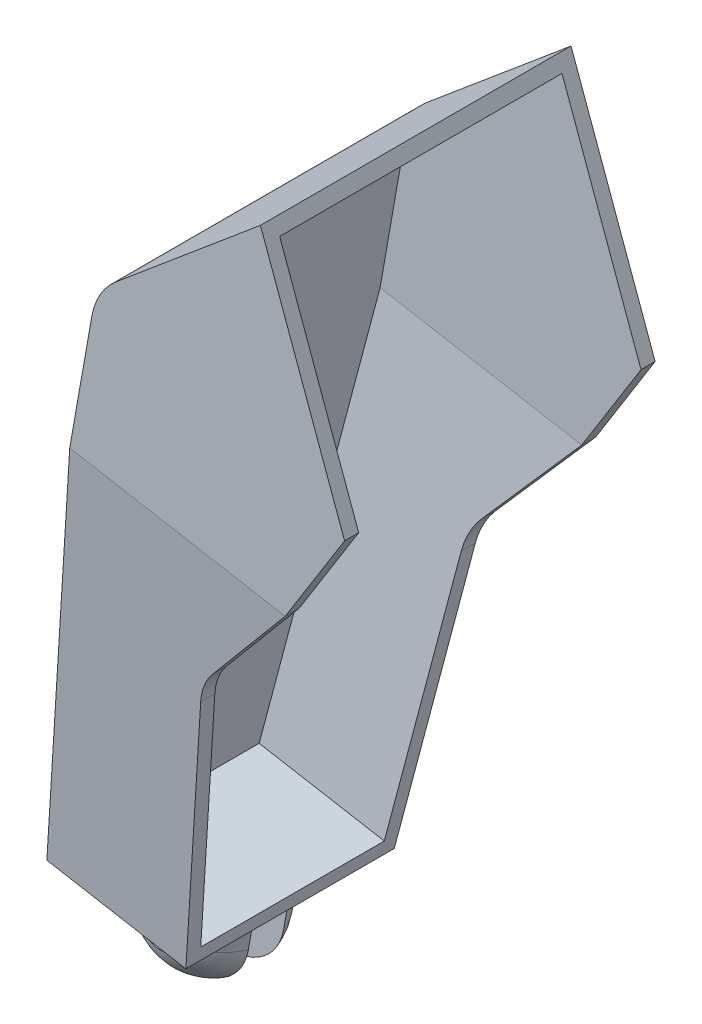
ISO-10303-21;
HEADER;
FILE_DESCRIPTION(('STEP AP214'),'2;1');
FILE_NAME('part.step','',(''),(''),'','','');
FILE_SCHEMA(('AUTOMOTIVE_DESIGN { 1 0 10303 214 1 1 1 1 }'));
ENDSEC;
DATA;
#1=APPLICATION_CONTEXT('core data for automotive mechanical design processes');
#2=APPLICATION_PROTOCOL_DEFINITION('international standard','automotive_design',2000,#1);
#3=PRODUCT_CONTEXT('',#1,'mechanical');
#4=PRODUCT('Part','Part','',(#3));
#5=PRODUCT_RELATED_PRODUCT_CATEGORY('part','',(#4));
#6=PRODUCT_DEFINITION_FORMATION('','',#4);
#7=PRODUCT_DEFINITION_CONTEXT('part definition',#1,'design');
#8=PRODUCT_DEFINITION('design','',#6,#7);
#9=PRODUCT_DEFINITION_SHAPE('','',#8);
#10=(LENGTH_UNIT() NAMED_UNIT(*) SI_UNIT(.MILLI.,.METRE.));
#11=(NAMED_UNIT(*) PLANE_ANGLE_UNIT() SI_UNIT($,.RADIAN.));
#12=(NAMED_UNIT(*) SI_UNIT($,.STERADIAN.) SOLID_ANGLE_UNIT());
#13=UNCERTAINTY_MEASURE_WITH_UNIT(LENGTH_MEASURE(1.E-05),#10,'distance_accuracy_value','');
#14=(GEOMETRIC_REPRESENTATION_CONTEXT(3) GLOBAL_UNCERTAINTY_ASSIGNED_CONTEXT((#13)) GLOBAL_UNIT_ASSIGNED_CONTEXT((#10,
#11,#12)) REPRESENTATION_CONTEXT('',''));
#15=CARTESIAN_POINT('',(0.,0.,0.));
#16=DIRECTION('',(0.,0.,1.));
#17=DIRECTION('',(1.,0.,0.));
#18=AXIS2_PLACEMENT_3D('',#15,#16,#17);
#19=CARTESIAN_POINT('',(-14.4608286388368,-56.6156186188573,0.));
#20=DIRECTION('',(0.173648177666934,0.984807753012207,0.));
#21=DIRECTION('',(-0.984807753012207,0.173648177666935,0.));
#22=AXIS2_PLACEMENT_3D('',#19,#20,#21);
#23=CYLINDRICAL_SURFACE('',#22,8.);
#24=CARTESIAN_POINT('',(-14.4608286388368,-56.6156186188573,0.));
#25=DIRECTION('',(-0.173648177666935,-0.984807753012207,0.));
#26=DIRECTION('',(0.984807753012207,-0.173648177666935,0.));
#27=AXIS2_PLACEMENT_3D('',#24,#25,#26);
#28=CIRCLE('',#27,8.);
#29=CARTESIAN_POINT('',(-11.9988092563063,-57.0497390630246,-7.59934207678533));
#30=VERTEX_POINT('',#29);
#31=CARTESIAN_POINT('',(-6.97693764382676,-57.9352305219587,-2.5));
#32=VERTEX_POINT('',#31);
#33=EDGE_CURVE('E231',#30,#32,#28,.T.);
#34=ORIENTED_EDGE('',*,*,#33,.F.);
#35=CARTESIAN_POINT('',(-11.9988092563063,-57.0497390630246,-7.59934207678533));
#36=CARTESIAN_POINT('',(-11.986911665757,-56.9823146897524,-7.59933203220922));
#37=CARTESIAN_POINT('',(-11.9778018977963,-56.9144045369731,-7.60026710840752));
#38=CARTESIAN_POINT('',(-11.9651804501062,-56.7781308140768,-7.60395280971297));
#39=CARTESIAN_POINT('',(-11.9616674218779,-56.7097673571681,-7.60670299725467));
#40=CARTESIAN_POINT('',(-11.9602580359532,-56.5732555667083,-7.61393458112745));
#41=CARTESIAN_POINT('',(-11.9623466338651,-56.5051071480988,-7.61841131278036));
#42=CARTESIAN_POINT('',(-11.9720563796974,-56.3693459735373,-7.6289504842887));
#43=CARTESIAN_POINT('',(-11.9796776920844,-56.3017332335693,-7.63501297127916));
#44=CARTESIAN_POINT('',(-12.0107279213109,-56.100459949405,-7.65531370854753));
#45=CARTESIAN_POINT('',(-12.0423415697917,-55.9681803915759,-7.67167572075674));
#46=CARTESIAN_POINT('',(-12.1263132939414,-55.7109717660266,-7.70820192005305));
#47=CARTESIAN_POINT('',(-12.1786821543027,-55.586046558549,-7.72836808096862));
#48=CARTESIAN_POINT('',(-12.3046448605937,-55.3427482657027,-7.77100200100207));
#49=CARTESIAN_POINT('',(-12.3788455500893,-55.2246977097717,-7.79352168290434));
#50=CARTESIAN_POINT('',(-12.5458846803246,-55.0024466228951,-7.83788426191899));
#51=CARTESIAN_POINT('',(-12.6387263222109,-54.8982484758914,-7.85972704204464));
#52=CARTESIAN_POINT('',(-12.8431005379144,-54.7042732606988,-7.90087147079049));
#53=CARTESIAN_POINT('',(-12.9550084105571,-54.614875729897,-7.92010445950432));
#54=CARTESIAN_POINT('',(-13.1929881001554,-54.4562165636242,-7.95325160259884));
#55=CARTESIAN_POINT('',(-13.3190560093785,-54.3869493916336,-7.96716721976608));
#56=CARTESIAN_POINT('',(-13.5776350899435,-54.2726872917639,-7.98774341182992));
#57=CARTESIAN_POINT('',(-13.7098273280441,-54.2270092395066,-7.99461464054537));
#58=CARTESIAN_POINT('',(-13.9801340944216,-54.1583095791482,-8.00107192504111));
#59=CARTESIAN_POINT('',(-14.1182473906508,-54.1352832813423,-8.00065948912979));
#60=CARTESIAN_POINT('',(-14.3913407105814,-54.112960728774,-7.99274230032514));
#61=CARTESIAN_POINT('',(-14.5262642522517,-54.1128725353329,-7.98548293529422));
#62=CARTESIAN_POINT('',(-14.7939152414185,-54.1342720022124,-7.96498949974384));
#63=CARTESIAN_POINT('',(-14.9266425704505,-54.1557608225733,-7.95175510801139));
#64=CARTESIAN_POINT('',(-15.1880187980339,-54.2198874665731,-7.9204691112071));
#65=CARTESIAN_POINT('',(-15.3165978158428,-54.2627811480784,-7.90236047967987));
#66=CARTESIAN_POINT('',(-15.5648021209183,-54.3685203602263,-7.8632342385186));
#67=CARTESIAN_POINT('',(-15.6844252286769,-54.4313707281445,-7.8422159243077));
#68=CARTESIAN_POINT('',(-15.9166534247685,-54.5784055906833,-7.79847545376802));
#69=CARTESIAN_POINT('',(-16.0287598091777,-54.6633685712468,-7.77571879037652));
#70=CARTESIAN_POINT('',(-16.2373761622307,-54.8510874963556,-7.73181622612155));
#71=CARTESIAN_POINT('',(-16.3338814283951,-54.953848786395,-7.71067081193134));
#72=CARTESIAN_POINT('',(-16.5095959927525,-55.1758840412729,-7.67220528704821));
#73=CARTESIAN_POINT('',(-16.5885898912219,-55.2953370120725,-7.65493278862475));
#74=CARTESIAN_POINT('',(-16.7251855896486,-55.5464865148217,-7.62673815128782));
#75=CARTESIAN_POINT('',(-16.7828203784918,-55.6781637697896,-7.61580620458632));
#76=CARTESIAN_POINT('',(-16.849080977384,-55.8738082876989,-7.60564225124819));
#77=CARTESIAN_POINT('',(-16.8671107612119,-55.9345703975068,-7.60328541577438));
#78=CARTESIAN_POINT('',(-16.8984930104579,-56.0572385889805,-7.60013482131107));
#79=CARTESIAN_POINT('',(-16.9118520589791,-56.1191429300401,-7.59933885501905));
#80=CARTESIAN_POINT('',(-16.9228480213674,-56.1814981746899,-7.59934207678533));
#81=B_SPLINE_CURVE_WITH_KNOTS('',3,(#35,#36,#37,#38,#39,#40,#41,#42,#43,#44,#45,#46,#47,#48,#49,
#50,#51,#52,#53,#54,#55,#56,#57,#58,#59,#60,#61,#62,#63,#64,#65,#66,#67,#68,#69,#70,#71,#72,#73,
#74,#75,#76,#77,#78,#79,#80),.UNSPECIFIED.,.F.,.F.,(4,2,2,2,2,2,2,2,2,2,2,2,2,2,2,2,2,2,2,2,2,2,
4),(0.,0.205323959879014,0.410598440771326,0.615322164613754,0.820051974362706,1.22896577749256,
1.63809233699274,2.05988351400979,2.48174718582288,2.91315381297358,3.34444167638914,
3.7624189439242,4.18030965733329,4.58377069824372,4.98725343150324,5.39567896994656,
5.8042035818021,6.22971654236829,6.6553575226076,7.0859747210149,7.51592403685478,
7.70602799872317,7.89586293072484),.UNSPECIFIED.);
#82=CARTESIAN_POINT('',(-16.9228480213674,-56.1814981746899,-7.59934207678533));
#83=VERTEX_POINT('',#82);
#84=EDGE_CURVE('E54',#30,#83,#81,.T.);
#85=ORIENTED_EDGE('',*,*,#84,.T.);
#86=CARTESIAN_POINT('',(-21.9447196338469,-55.2960067157558,-2.5));
#87=VERTEX_POINT('',#86);
#88=EDGE_CURVE('E232',#87,#83,#28,.T.);
#89=ORIENTED_EDGE('',*,*,#88,.F.);
#90=DIRECTION('',(0.173648177666934,0.984807753012207,0.));
#91=VECTOR('',#90,1.);
#92=CARTESIAN_POINT('',(-21.9447196338469,-55.2960067157558,-2.5));
#93=LINE('',#92,#91);
#94=CARTESIAN_POINT('',(-20.9028305678453,-49.3871601976826,-2.5));
#95=VERTEX_POINT('',#94);
#96=EDGE_CURVE('E237',#87,#95,#93,.T.);
#97=ORIENTED_EDGE('',*,*,#96,.T.);
#98=CARTESIAN_POINT('',(-13.4189395728352,-50.706772100784,0.));
#99=DIRECTION('',(-0.173648177666935,-0.984807753012207,0.));
#100=DIRECTION('',(0.984807753012207,-0.173648177666935,0.));
#101=AXIS2_PLACEMENT_3D('',#98,#99,#100);
#102=CIRCLE('',#101,8.);
#103=CARTESIAN_POINT('',(-5.93504857782515,-52.0263840038855,-2.5));
#104=VERTEX_POINT('',#103);
#105=EDGE_CURVE('E436',#95,#104,#102,.T.);
#106=ORIENTED_EDGE('',*,*,#105,.T.);
#107=DIRECTION('',(0.173648177666934,0.984807753012207,0.));
#108=VECTOR('',#107,1.);
#109=CARTESIAN_POINT('',(-6.97693764382676,-57.9352305219587,-2.5));
#110=LINE('',#109,#108);
#111=EDGE_CURVE('E694',#104,#32,#110,.F.);
#112=ORIENTED_EDGE('',*,*,#111,.T.);
#113=EDGE_LOOP('',(#34,#85,#89,#97,#106,#112));
#114=FACE_BOUND('',#113,.T.);
#115=ADVANCED_FACE('F39',(#114),#23,.T.);
#116=CARTESIAN_POINT('',(-14.4608286388368,-56.6156186188573,0.));
#117=DIRECTION('',(0.173648177666934,0.984807753012207,0.));
#118=DIRECTION('',(-0.984807753012207,0.173648177666934,0.));
#119=AXIS2_PLACEMENT_3D('',#116,#117,#118);
#120=SPHERICAL_SURFACE('',#119,8.);
#121=ORIENTED_EDGE('',*,*,#88,.T.);
#122=CARTESIAN_POINT('',(-14.4608286388368,-56.6156186188573,-7.59934207678533));
#123=DIRECTION('',(0.,0.,1.));
#124=DIRECTION('',(1.,0.,0.));
#125=AXIS2_PLACEMENT_3D('',#122,#123,#124);
#126=CIRCLE('',#125,2.5);
#127=EDGE_CURVE('E224',#83,#30,#126,.T.);
#128=ORIENTED_EDGE('',*,*,#127,.T.);
#129=ORIENTED_EDGE('',*,*,#33,.T.);
#130=CARTESIAN_POINT('',(-14.4608286388368,-56.6156186188573,-2.5));
#131=DIRECTION('',(0.,0.,-1.));
#132=DIRECTION('',(0.,1.,0.));
#133=AXIS2_PLACEMENT_3D('',#130,#131,#132);
#134=CIRCLE('',#133,7.59934207678533);
#135=EDGE_CURVE('E11',#32,#87,#134,.T.);
#136=ORIENTED_EDGE('',*,*,#135,.T.);
#137=EDGE_LOOP('',(#121,#128,#129,#136));
#138=FACE_BOUND('',#137,.T.);
#139=ADVANCED_FACE('F241',(#138),#120,.T.);
#140=CARTESIAN_POINT('',(-9.659894213322,28.1995383371761,20.));
#141=DIRECTION('',(0.984807753012207,-0.173648177666935,0.));
#142=DIRECTION('',(0.173648177666935,0.984807753012207,0.));
#143=AXIS2_PLACEMENT_3D('',#140,#141,#142);
#144=PLANE('',#143);
#145=DIRECTION('',(0.172412384214125,0.977799220070488,-0.119090952633464));
#146=VECTOR('',#145,1.);
#147=CARTESIAN_POINT('',(-12.7855614113268,10.4729987829563,-22.));
#148=LINE('',#147,#146);
#149=CARTESIAN_POINT('',(-23.2670171029573,-48.9702903241147,-14.7601108876757));
#150=VERTEX_POINT('',#149);
#151=CARTESIAN_POINT('',(-12.7855614113268,10.4729987829563,-22.));
#152=VERTEX_POINT('',#151);
#153=EDGE_CURVE('E481',#150,#152,#148,.T.);
#154=ORIENTED_EDGE('',*,*,#153,.F.);
#155=DIRECTION('',(0.,0.,1.));
#156=VECTOR('',#155,1.);
#157=CARTESIAN_POINT('',(-23.2670171029573,-48.9702903241147,-14.7601108876757));
#158=LINE('',#157,#156);
#159=CARTESIAN_POINT('',(-23.2670171029573,-48.9702903241147,14.7601108876757));
#160=VERTEX_POINT('',#159);
#161=EDGE_CURVE('E229',#150,#160,#158,.T.);
#162=ORIENTED_EDGE('',*,*,#161,.T.);
#163=DIRECTION('',(0.172412384214125,0.977799220070488,0.119090952633464));
#164=VECTOR('',#163,1.);
#165=CARTESIAN_POINT('',(-12.7855614113268,10.4729987829563,22.));
#166=LINE('',#165,#164);
#167=CARTESIAN_POINT('',(-12.7855614113268,10.4729987829563,22.));
#168=VERTEX_POINT('',#167);
#169=EDGE_CURVE('E516',#160,#168,#166,.T.);
#170=ORIENTED_EDGE('',*,*,#169,.T.);
#171=DIRECTION('',(-0.173648177666935,-0.984807753012207,0.));
#172=VECTOR('',#171,1.);
#173=CARTESIAN_POINT('',(-9.659894213322,28.1995383371761,22.));
#174=LINE('',#173,#172);
#175=CARTESIAN_POINT('',(-9.659894213322,28.1995383371761,22.));
#176=VERTEX_POINT('',#175);
#177=EDGE_CURVE('E532',#176,#168,#174,.T.);
#178=ORIENTED_EDGE('',*,*,#177,.F.);
#179=DIRECTION('',(0.,0.,-1.));
#180=VECTOR('',#179,1.);
#181=CARTESIAN_POINT('',(-9.659894213322,28.1995383371761,20.));
#182=LINE('',#181,#180);
#183=CARTESIAN_POINT('',(-9.659894213322,28.1995383371761,-22.));
#184=VERTEX_POINT('',#183);
#185=EDGE_CURVE('E418',#176,#184,#182,.T.);
#186=ORIENTED_EDGE('',*,*,#185,.T.);
#187=DIRECTION('',(-0.173648177666935,-0.984807753012207,0.));
#188=VECTOR('',#187,1.);
#189=CARTESIAN_POINT('',(-9.659894213322,28.1995383371761,-22.));
#190=LINE('',#189,#188);
#191=EDGE_CURVE('E497',#184,#152,#190,.T.);
#192=ORIENTED_EDGE('',*,*,#191,.T.);
#193=EDGE_LOOP('',(#154,#162,#170,#178,#186,#192));
#194=FACE_BOUND('',#193,.T.);
#195=ADVANCED_FACE('F295',(#194),#144,.F.);
#196=CARTESIAN_POINT('',(-7.81668424310827,27.1353605647001,20.));
#197=DIRECTION('',(0.984807753012207,-0.173648177666935,0.));
#198=DIRECTION('',(0.173648177666935,0.984807753012207,0.));
#199=AXIS2_PLACEMENT_3D('',#196,#197,#198);
#200=PLANE('',#199);
#201=DIRECTION('',(0.,0.,-1.));
#202=VECTOR('',#201,1.);
#203=CARTESIAN_POINT('',(-20.950105241599,-47.3479711734241,20.));
#204=LINE('',#203,#202);
#205=CARTESIAN_POINT('',(-20.950105241599,-47.3479711734241,13.));
#206=VERTEX_POINT('',#205);
#207=CARTESIAN_POINT('',(-20.950105241599,-47.3479711734241,-13.));
#208=VERTEX_POINT('',#207);
#209=EDGE_CURVE('E420',#206,#208,#204,.T.);
#210=ORIENTED_EDGE('',*,*,#209,.T.);
#211=DIRECTION('',(-0.172412384214125,-0.977799220070488,0.119090952633464));
#212=VECTOR('',#211,1.);
#213=CARTESIAN_POINT('',(-10.8159459053024,10.1257024276225,-20.));
#214=LINE('',#213,#212);
#215=CARTESIAN_POINT('',(-10.8159459053024,10.1257024276225,-20.));
#216=VERTEX_POINT('',#215);
#217=EDGE_CURVE('E404',#216,#208,#214,.T.);
#218=ORIENTED_EDGE('',*,*,#217,.F.);
#219=DIRECTION('',(-0.173648177666935,-0.984807753012207,0.));
#220=VECTOR('',#219,1.);
#221=CARTESIAN_POINT('',(-7.81668424310827,27.1353605647001,-20.));
#222=LINE('',#221,#220);
#223=CARTESIAN_POINT('',(-7.81668424310827,27.1353605647001,-20.));
#224=VERTEX_POINT('',#223);
#225=EDGE_CURVE('E401',#224,#216,#222,.T.);
#226=ORIENTED_EDGE('',*,*,#225,.F.);
#227=DIRECTION('',(0.,0.,-1.));
#228=VECTOR('',#227,1.);
#229=CARTESIAN_POINT('',(-7.81668424310827,27.1353605647001,20.));
#230=LINE('',#229,#228);
#231=CARTESIAN_POINT('',(-7.81668424310827,27.1353605647001,20.));
#232=VERTEX_POINT('',#231);
#233=EDGE_CURVE('E423',#232,#224,#230,.T.);
#234=ORIENTED_EDGE('',*,*,#233,.F.);
#235=DIRECTION('',(-0.173648177666935,-0.984807753012207,0.));
#236=VECTOR('',#235,1.);
#237=CARTESIAN_POINT('',(-7.81668424310827,27.1353605647001,20.));
#238=LINE('',#237,#236);
#239=CARTESIAN_POINT('',(-10.8159459053024,10.1257024276225,20.));
#240=VERTEX_POINT('',#239);
#241=EDGE_CURVE('E407',#232,#240,#238,.T.);
#242=ORIENTED_EDGE('',*,*,#241,.T.);
#243=DIRECTION('',(-0.172412384214125,-0.977799220070488,-0.119090952633464));
#244=VECTOR('',#243,1.);
#245=CARTESIAN_POINT('',(-10.8159459053024,10.1257024276225,20.));
#246=LINE('',#245,#244);
#247=EDGE_CURVE('E399',#240,#206,#246,.T.);
#248=ORIENTED_EDGE('',*,*,#247,.T.);
#249=EDGE_LOOP('',(#210,#218,#226,#234,#242,#248));
#250=FACE_BOUND('',#249,.T.);
#251=ADVANCED_FACE('F377',(#250),#200,.T.);
#252=CARTESIAN_POINT('',(14.2294707775733,51.2991685834183,20.));
#253=DIRECTION('',(0.939692620785911,0.342020143325662,0.));
#254=DIRECTION('',(-0.342020143325662,0.939692620785911,0.));
#255=AXIS2_PLACEMENT_3D('',#252,#253,#254);
#256=PLANE('',#255);
#257=DIRECTION('',(0.,0.,-1.));
#258=VECTOR('',#257,1.);
#259=CARTESIAN_POINT('',(14.9574112461057,49.2991685834183,20.));
#260=LINE('',#259,#258);
#261=CARTESIAN_POINT('',(14.9574112461057,49.2991685834183,20.));
#262=VERTEX_POINT('',#261);
#263=CARTESIAN_POINT('',(14.9574112461057,49.2991685834183,-20.));
#264=VERTEX_POINT('',#263);
#265=EDGE_CURVE('E394',#262,#264,#260,.T.);
#266=ORIENTED_EDGE('',*,*,#265,.T.);
#267=DIRECTION('',(-0.342020143325662,0.939692620785911,0.));
#268=VECTOR('',#267,1.);
#269=CARTESIAN_POINT('',(14.2294707775733,51.2991685834183,-20.));
#270=LINE('',#269,#268);
#271=CARTESIAN_POINT('',(26.1510654801716,18.544856334139,-20.));
#272=VERTEX_POINT('',#271);
#273=EDGE_CURVE('E486',#272,#264,#270,.T.);
#274=ORIENTED_EDGE('',*,*,#273,.F.);
#275=DIRECTION('',(0.,0.,1.));
#276=VECTOR('',#275,1.);
#277=CARTESIAN_POINT('',(26.1510654801716,18.544856334139,-22.));
#278=LINE('',#277,#276);
#279=CARTESIAN_POINT('',(26.1510654801716,18.544856334139,-22.));
#280=VERTEX_POINT('',#279);
#281=EDGE_CURVE('E514',#280,#272,#278,.T.);
#282=ORIENTED_EDGE('',*,*,#281,.F.);
#283=DIRECTION('',(-0.342020143325662,0.939692620785911,0.));
#284=VECTOR('',#283,1.);
#285=CARTESIAN_POINT('',(14.2294707775733,51.2991685834183,-22.));
#286=LINE('',#285,#284);
#287=CARTESIAN_POINT('',(14.2294707775733,51.2991685834183,-22.));
#288=VERTEX_POINT('',#287);
#289=EDGE_CURVE('E487',#280,#288,#286,.T.);
#290=ORIENTED_EDGE('',*,*,#289,.T.);
#291=DIRECTION('',(0.,0.,-1.));
#292=VECTOR('',#291,1.);
#293=CARTESIAN_POINT('',(14.2294707775733,51.2991685834183,20.));
#294=LINE('',#293,#292);
#295=CARTESIAN_POINT('',(14.2294707775733,51.2991685834183,22.));
#296=VERTEX_POINT('',#295);
#297=EDGE_CURVE('E413',#296,#288,#294,.T.);
#298=ORIENTED_EDGE('',*,*,#297,.F.);
#299=DIRECTION('',(-0.342020143325662,0.939692620785911,0.));
#300=VECTOR('',#299,1.);
#301=CARTESIAN_POINT('',(14.2294707775733,51.2991685834183,22.));
#302=LINE('',#301,#300);
#303=CARTESIAN_POINT('',(26.1510654801716,18.544856334139,22.));
#304=VERTEX_POINT('',#303);
#305=EDGE_CURVE('E522',#304,#296,#302,.T.);
#306=ORIENTED_EDGE('',*,*,#305,.F.);
#307=DIRECTION('',(0.,0.,-1.));
#308=VECTOR('',#307,1.);
#309=CARTESIAN_POINT('',(26.1510654801716,18.544856334139,22.));
#310=LINE('',#309,#308);
#311=CARTESIAN_POINT('',(26.1510654801716,18.544856334139,20.));
#312=VERTEX_POINT('',#311);
#313=EDGE_CURVE('E539',#304,#312,#310,.T.);
#314=ORIENTED_EDGE('',*,*,#313,.T.);
#315=DIRECTION('',(-0.342020143325662,0.939692620785911,0.));
#316=VECTOR('',#315,1.);
#317=CARTESIAN_POINT('',(14.2294707775733,51.2991685834183,20.));
#318=LINE('',#317,#316);
#319=EDGE_CURVE('E521',#312,#262,#318,.T.);
#320=ORIENTED_EDGE('',*,*,#319,.T.);
#321=EDGE_LOOP('',(#266,#274,#282,#290,#298,#306,#314,#320));
#322=FACE_BOUND('',#321,.T.);
#323=ADVANCED_FACE('F41',(#322),#256,.T.);
#324=CARTESIAN_POINT('',(14.2294707775733,51.2991685834183,20.));
#325=DIRECTION('',(0.642787609686535,-0.766044443118982,0.));
#326=DIRECTION('',(0.766044443118982,0.642787609686535,0.));
#327=AXIS2_PLACEMENT_3D('',#324,#325,#326);
#328=PLANE('',#327);
#329=ORIENTED_EDGE('',*,*,#297,.T.);
#330=DIRECTION('',(-0.766044443118982,-0.642787609686535,0.));
#331=VECTOR('',#330,1.);
#332=CARTESIAN_POINT('',(14.2294707775733,51.2991685834183,-22.));
#333=LINE('',#332,#331);
#334=CARTESIAN_POINT('',(-6.23969278006529,34.1235009916965,-22.));
#335=VERTEX_POINT('',#334);
#336=EDGE_CURVE('E503',#288,#335,#333,.T.);
#337=ORIENTED_EDGE('',*,*,#336,.T.);
#338=DIRECTION('',(0.,0.,-1.));
#339=VECTOR('',#338,1.);
#340=CARTESIAN_POINT('',(-6.23969278006528,34.1235009916965,20.));
#341=LINE('',#340,#339);
#342=CARTESIAN_POINT('',(-6.23969278006529,34.1235009916965,22.));
#343=VERTEX_POINT('',#342);
#344=EDGE_CURVE('E416',#343,#335,#341,.T.);
#345=ORIENTED_EDGE('',*,*,#344,.F.);
#346=DIRECTION('',(-0.766044443118982,-0.642787609686535,0.));
#347=VECTOR('',#346,1.);
#348=CARTESIAN_POINT('',(14.2294707775733,51.2991685834183,22.));
#349=LINE('',#348,#347);
#350=EDGE_CURVE('E525',#296,#343,#349,.T.);
#351=ORIENTED_EDGE('',*,*,#350,.F.);
#352=EDGE_LOOP('',(#329,#337,#345,#351));
#353=FACE_BOUND('',#352,.T.);
#354=ADVANCED_FACE('F366',(#353),#328,.F.);
#355=CARTESIAN_POINT('',(0.18818331680007,26.4630565605067,20.));
#356=DIRECTION('',(0.,0.,-1.));
#357=DIRECTION('',(-1.,0.,0.));
#358=AXIS2_PLACEMENT_3D('',#355,#356,#357);
#359=CYLINDRICAL_SURFACE('',#358,10.);
#360=ORIENTED_EDGE('',*,*,#344,.T.);
#361=CARTESIAN_POINT('',(0.18818331680007,26.4630565605067,-22.));
#362=DIRECTION('',(0.,0.,1.));
#363=DIRECTION('',(1.,0.,0.));
#364=AXIS2_PLACEMENT_3D('',#361,#362,#363);
#365=CIRCLE('',#364,10.);
#366=EDGE_CURVE('E500',#335,#184,#365,.T.);
#367=ORIENTED_EDGE('',*,*,#366,.T.);
#368=ORIENTED_EDGE('',*,*,#185,.F.);
#369=CARTESIAN_POINT('',(0.18818331680007,26.4630565605067,22.));
#370=DIRECTION('',(0.,0.,1.));
#371=DIRECTION('',(1.,0.,0.));
#372=AXIS2_PLACEMENT_3D('',#369,#370,#371);
#373=CIRCLE('',#372,10.);
#374=EDGE_CURVE('E529',#343,#176,#373,.T.);
#375=ORIENTED_EDGE('',*,*,#374,.F.);
#376=EDGE_LOOP('',(#360,#367,#368,#375));
#377=FACE_BOUND('',#376,.T.);
#378=ADVANCED_FACE('F369',(#377),#359,.T.);
#379=CARTESIAN_POINT('',(2.03139328701382,25.3988787880308,20.));
#380=DIRECTION('',(0.,0.,-1.));
#381=DIRECTION('',(-1.,0.,0.));
#382=AXIS2_PLACEMENT_3D('',#379,#380,#381);
#383=CYLINDRICAL_SURFACE('',#382,10.);
#384=CARTESIAN_POINT('',(2.03139328701382,25.3988787880308,-20.));
#385=DIRECTION('',(0.,0.,-1.));
#386=DIRECTION('',(-1.,0.,0.));
#387=AXIS2_PLACEMENT_3D('',#384,#385,#386);
#388=CIRCLE('',#387,10.);
#389=CARTESIAN_POINT('',(-4.39648280985151,33.0593232192206,-20.));
#390=VERTEX_POINT('',#389);
#391=EDGE_CURVE('E398',#224,#390,#388,.T.);
#392=ORIENTED_EDGE('',*,*,#391,.T.);
#393=DIRECTION('',(0.,0.,-1.));
#394=VECTOR('',#393,1.);
#395=CARTESIAN_POINT('',(-4.39648280985151,33.0593232192206,20.));
#396=LINE('',#395,#394);
#397=CARTESIAN_POINT('',(-4.39648280985151,33.0593232192206,20.));
#398=VERTEX_POINT('',#397);
#399=EDGE_CURVE('E396',#398,#390,#396,.T.);
#400=ORIENTED_EDGE('',*,*,#399,.F.);
#401=CARTESIAN_POINT('',(2.03139328701382,25.3988787880308,20.));
#402=DIRECTION('',(0.,0.,-1.));
#403=DIRECTION('',(-1.,0.,0.));
#404=AXIS2_PLACEMENT_3D('',#401,#402,#403);
#405=CIRCLE('',#404,10.);
#406=EDGE_CURVE('E552',#232,#398,#405,.T.);
#407=ORIENTED_EDGE('',*,*,#406,.F.);
#408=ORIENTED_EDGE('',*,*,#233,.T.);
#409=EDGE_LOOP('',(#392,#400,#407,#408));
#410=FACE_BOUND('',#409,.T.);
#411=ADVANCED_FACE('F373',(#410),#383,.F.);
#412=CARTESIAN_POINT('',(14.9574112461057,49.2991685834183,20.));
#413=DIRECTION('',(0.642787609686535,-0.766044443118982,0.));
#414=DIRECTION('',(0.766044443118982,0.642787609686535,0.));
#415=AXIS2_PLACEMENT_3D('',#412,#413,#414);
#416=PLANE('',#415);
#417=DIRECTION('',(-0.766044443118982,-0.642787609686535,0.));
#418=VECTOR('',#417,1.);
#419=CARTESIAN_POINT('',(14.9574112461057,49.2991685834183,-20.));
#420=LINE('',#419,#418);
#421=EDGE_CURVE('E391',#264,#390,#420,.T.);
#422=ORIENTED_EDGE('',*,*,#421,.F.);
#423=ORIENTED_EDGE('',*,*,#265,.F.);
#424=DIRECTION('',(-0.766044443118982,-0.642787609686535,0.));
#425=VECTOR('',#424,1.);
#426=CARTESIAN_POINT('',(14.9574112461057,49.2991685834183,20.));
#427=LINE('',#426,#425);
#428=EDGE_CURVE('E412',#262,#398,#427,.T.);
#429=ORIENTED_EDGE('',*,*,#428,.T.);
#430=ORIENTED_EDGE('',*,*,#399,.T.);
#431=EDGE_LOOP('',(#422,#423,#429,#430));
#432=FACE_BOUND('',#431,.T.);
#433=ADVANCED_FACE('F364',(#432),#416,.T.);
#434=CARTESIAN_POINT('',(26.1510654801716,18.544856334139,22.));
#435=DIRECTION('',(-0.848048096156428,0.529919264233202,0.));
#436=DIRECTION('',(-0.529919264233202,-0.848048096156428,0.));
#437=AXIS2_PLACEMENT_3D('',#434,#435,#436);
#438=PLANE('',#437);
#439=DIRECTION('',(0.529919264233202,0.848048096156428,0.));
#440=VECTOR('',#439,1.);
#441=CARTESIAN_POINT('',(26.1510654801716,18.544856334139,20.));
#442=LINE('',#441,#440);
#443=CARTESIAN_POINT('',(17.7434789320516,5.08990527528138,20.));
#444=VERTEX_POINT('',#443);
#445=EDGE_CURVE('E526',#444,#312,#442,.T.);
#446=ORIENTED_EDGE('',*,*,#445,.T.);
#447=ORIENTED_EDGE('',*,*,#313,.F.);
#448=DIRECTION('',(0.529919264233202,0.848048096156428,0.));
#449=VECTOR('',#448,1.);
#450=CARTESIAN_POINT('',(26.1510654801716,18.544856334139,22.));
#451=LINE('',#450,#449);
#452=CARTESIAN_POINT('',(17.7434789320516,5.08990527528138,22.));
#453=VERTEX_POINT('',#452);
#454=EDGE_CURVE('E537',#453,#304,#451,.T.);
#455=ORIENTED_EDGE('',*,*,#454,.F.);
#456=DIRECTION('',(0.,0.,-1.));
#457=VECTOR('',#456,1.);
#458=CARTESIAN_POINT('',(17.7434789320516,5.08990527528138,22.));
#459=LINE('',#458,#457);
#460=EDGE_CURVE('E548',#453,#444,#459,.T.);
#461=ORIENTED_EDGE('',*,*,#460,.T.);
#462=EDGE_LOOP('',(#446,#447,#455,#461));
#463=FACE_BOUND('',#462,.T.);
#464=ADVANCED_FACE('F357',(#463),#438,.F.);
#465=CARTESIAN_POINT('',(0.18818331680007,26.4630565605067,22.));
#466=DIRECTION('',(0.,0.,1.));
#467=DIRECTION('',(1.,0.,0.));
#468=AXIS2_PLACEMENT_3D('',#465,#466,#467);
#469=PLANE('',#468);
#470=ORIENTED_EDGE('',*,*,#305,.T.);
#471=ORIENTED_EDGE('',*,*,#350,.T.);
#472=ORIENTED_EDGE('',*,*,#374,.T.);
#473=ORIENTED_EDGE('',*,*,#177,.T.);
#474=DIRECTION('',(0.984807753012207,-0.173648177666935,0.));
#475=VECTOR('',#474,1.);
#476=CARTESIAN_POINT('',(-12.7855614113268,10.4729987829563,22.));
#477=LINE('',#476,#475);
#478=EDGE_CURVE('E534',#168,#453,#477,.T.);
#479=ORIENTED_EDGE('',*,*,#478,.T.);
#480=ORIENTED_EDGE('',*,*,#454,.T.);
#481=EDGE_LOOP('',(#470,#471,#472,#473,#479,#480));
#482=FACE_BOUND('',#481,.T.);
#483=ADVANCED_FACE('F354',(#482),#469,.T.);
#484=CARTESIAN_POINT('',(0.18818331680007,26.4630565605067,20.));
#485=DIRECTION('',(0.,0.,1.));
#486=DIRECTION('',(1.,0.,0.));
#487=AXIS2_PLACEMENT_3D('',#484,#485,#486);
#488=PLANE('',#487);
#489=ORIENTED_EDGE('',*,*,#241,.F.);
#490=ORIENTED_EDGE('',*,*,#406,.T.);
#491=ORIENTED_EDGE('',*,*,#428,.F.);
#492=ORIENTED_EDGE('',*,*,#319,.F.);
#493=ORIENTED_EDGE('',*,*,#445,.F.);
#494=DIRECTION('',(0.984807753012207,-0.173648177666935,0.));
#495=VECTOR('',#494,1.);
#496=CARTESIAN_POINT('',(-12.7855614113268,10.4729987829563,20.));
#497=LINE('',#496,#495);
#498=EDGE_CURVE('E542',#240,#444,#497,.T.);
#499=ORIENTED_EDGE('',*,*,#498,.F.);
#500=EDGE_LOOP('',(#489,#490,#491,#492,#493,#499));
#501=FACE_BOUND('',#500,.T.);
#502=ADVANCED_FACE('F349',(#501),#488,.F.);
#503=CARTESIAN_POINT('',(19.713094438076,4.74260891994751,22.));
#504=DIRECTION('',(-0.0206799269014203,-0.117281693467045,0.9928833491407));
#505=DIRECTION('',(0.,-0.993095725198677,-0.117306779821603));
#506=AXIS2_PLACEMENT_3D('',#503,#504,#505);
#507=PLANE('',#506);
#508=DIRECTION('',(-0.172412384214125,-0.977799220070488,-0.119090952633464));
#509=VECTOR('',#508,1.);
#510=CARTESIAN_POINT('',(6.91059364891731,7.00003522961766,22.));
#511=LINE('',#510,#509);
#512=CARTESIAN_POINT('',(3.22231720565507,-13.9172199087793,19.4523851218358));
#513=VERTEX_POINT('',#512);
#514=CARTESIAN_POINT('',(-3.57086204271316,-52.4432538774534,14.7601108876757));
#515=VERTEX_POINT('',#514);
#516=EDGE_CURVE('E479',#513,#515,#511,.T.);
#517=ORIENTED_EDGE('',*,*,#516,.F.);
#518=CARTESIAN_POINT('',(13.0703947357771,-15.6537016854486,19.4523851218358));
#519=DIRECTION('',(-0.0206799269014203,-0.117281693467045,0.9928833491407));
#520=DIRECTION('',(0.172412384214125,0.977799220070488,0.119090952633464));
#521=AXIS2_PLACEMENT_3D('',#518,#519,#520);
#522=ELLIPSE('',#521,10.0716766059725,10.);
#523=CARTESIAN_POINT('',(5.4945964322252,-9.1262764607601,20.065629900007));
#524=VERTEX_POINT('',#523);
#525=EDGE_CURVE('E471',#513,#524,#522,.F.);
#526=ORIENTED_EDGE('',*,*,#525,.T.);
#527=DIRECTION('',(-0.649301895758847,-0.753586602842738,-0.102539164127218));
#528=VECTOR('',#527,1.);
#529=CARTESIAN_POINT('',(18.4039210311937,5.85642131522783,22.1042984492157));
#530=LINE('',#529,#528);
#531=EDGE_CURVE('E464',#453,#524,#530,.T.);
#532=ORIENTED_EDGE('',*,*,#531,.F.);
#533=ORIENTED_EDGE('',*,*,#478,.F.);
#534=ORIENTED_EDGE('',*,*,#169,.F.);
#535=DIRECTION('',(-0.984807753012207,0.173648177666935,0.));
#536=VECTOR('',#535,1.);
#537=CARTESIAN_POINT('',(26.0389516107908,-57.6642629183161,14.7601108876757));
#538=LINE('',#537,#536);
#539=EDGE_CURVE('E444',#515,#160,#538,.T.);
#540=ORIENTED_EDGE('',*,*,#539,.F.);
#541=EDGE_LOOP('',(#517,#526,#532,#533,#534,#540));
#542=FACE_BOUND('',#541,.T.);
#543=ADVANCED_FACE('F346',(#542),#507,.T.);
#544=CARTESIAN_POINT('',(19.713094438076,4.74260891994751,20.));
#545=DIRECTION('',(0.0206799269014203,0.117281693467045,-0.9928833491407));
#546=DIRECTION('',(0.,0.993095725198677,0.117306779821603));
#547=AXIS2_PLACEMENT_3D('',#544,#545,#546);
#548=PLANE('',#547);
#549=DIRECTION('',(0.172412384214125,0.977799220070488,0.119090952633464));
#550=VECTOR('',#549,1.);
#551=CARTESIAN_POINT('',(6.91059364891731,7.00003522961766,20.));
#552=LINE('',#551,#550);
#553=CARTESIAN_POINT('',(-3.22356568737929,-50.4736383714289,13.));
#554=VERTEX_POINT('',#553);
#555=CARTESIAN_POINT('',(3.22231720565507,-13.9172199087793,17.4523851218358));
#556=VERTEX_POINT('',#555);
#557=EDGE_CURVE('E477',#554,#556,#552,.T.);
#558=ORIENTED_EDGE('',*,*,#557,.F.);
#559=DIRECTION('',(-0.984807753012207,0.173648177666935,0.));
#560=VECTOR('',#559,1.);
#561=CARTESIAN_POINT('',(9.5789351017794,-52.7310646810991,13.));
#562=LINE('',#561,#560);
#563=EDGE_CURVE('E519',#554,#206,#562,.T.);
#564=ORIENTED_EDGE('',*,*,#563,.T.);
#565=ORIENTED_EDGE('',*,*,#247,.F.);
#566=ORIENTED_EDGE('',*,*,#498,.T.);
#567=DIRECTION('',(0.649301895758847,0.753586602842738,0.102539164127218));
#568=VECTOR('',#567,1.);
#569=CARTESIAN_POINT('',(18.4039210311937,5.85642131522783,20.1042984492157));
#570=LINE('',#569,#568);
#571=CARTESIAN_POINT('',(5.4945964322252,-9.1262764607601,18.065629900007));
#572=VERTEX_POINT('',#571);
#573=EDGE_CURVE('E462',#572,#444,#570,.T.);
#574=ORIENTED_EDGE('',*,*,#573,.F.);
#575=CARTESIAN_POINT('',(13.0703947357771,-15.6537016854486,17.4523851218358));
#576=DIRECTION('',(0.0206799269014203,0.117281693467045,-0.9928833491407));
#577=DIRECTION('',(0.172412384214125,0.977799220070488,0.119090952633464));
#578=AXIS2_PLACEMENT_3D('',#575,#576,#577);
#579=ELLIPSE('',#578,10.0716766059725,10.);
#580=EDGE_CURVE('E468',#572,#556,#579,.F.);
#581=ORIENTED_EDGE('',*,*,#580,.T.);
#582=EDGE_LOOP('',(#558,#564,#565,#566,#574,#581));
#583=FACE_BOUND('',#582,.T.);
#584=ADVANCED_FACE('F344',(#583),#548,.T.);
#585=CARTESIAN_POINT('',(26.1510654801716,18.544856334139,-22.));
#586=DIRECTION('',(0.848048096156428,-0.529919264233202,0.));
#587=DIRECTION('',(0.529919264233202,0.848048096156428,0.));
#588=AXIS2_PLACEMENT_3D('',#585,#586,#587);
#589=PLANE('',#588);
#590=DIRECTION('',(0.529919264233202,0.848048096156428,0.));
#591=VECTOR('',#590,1.);
#592=CARTESIAN_POINT('',(26.1510654801716,18.544856334139,-20.));
#593=LINE('',#592,#591);
#594=CARTESIAN_POINT('',(17.7434789320516,5.08990527528138,-20.));
#595=VERTEX_POINT('',#594);
#596=EDGE_CURVE('E508',#595,#272,#593,.T.);
#597=ORIENTED_EDGE('',*,*,#596,.F.);
#598=DIRECTION('',(0.,0.,1.));
#599=VECTOR('',#598,1.);
#600=CARTESIAN_POINT('',(17.7434789320516,5.08990527528138,-22.));
#601=LINE('',#600,#599);
#602=CARTESIAN_POINT('',(17.7434789320516,5.08990527528138,-22.));
#603=VERTEX_POINT('',#602);
#604=EDGE_CURVE('E506',#603,#595,#601,.T.);
#605=ORIENTED_EDGE('',*,*,#604,.F.);
#606=DIRECTION('',(0.529919264233202,0.848048096156428,0.));
#607=VECTOR('',#606,1.);
#608=CARTESIAN_POINT('',(26.1510654801716,18.544856334139,-22.));
#609=LINE('',#608,#607);
#610=EDGE_CURVE('E490',#603,#280,#609,.T.);
#611=ORIENTED_EDGE('',*,*,#610,.T.);
#612=ORIENTED_EDGE('',*,*,#281,.T.);
#613=EDGE_LOOP('',(#597,#605,#611,#612));
#614=FACE_BOUND('',#613,.T.);
#615=ADVANCED_FACE('F337',(#614),#589,.T.);
#616=CARTESIAN_POINT('',(0.18818331680007,26.4630565605067,-22.));
#617=DIRECTION('',(0.,0.,-1.));
#618=DIRECTION('',(1.,0.,0.));
#619=AXIS2_PLACEMENT_3D('',#616,#617,#618);
#620=PLANE('',#619);
#621=ORIENTED_EDGE('',*,*,#289,.F.);
#622=ORIENTED_EDGE('',*,*,#610,.F.);
#623=DIRECTION('',(0.984807753012207,-0.173648177666935,0.));
#624=VECTOR('',#623,1.);
#625=CARTESIAN_POINT('',(-12.7855614113268,10.4729987829563,-22.));
#626=LINE('',#625,#624);
#627=EDGE_CURVE('E494',#152,#603,#626,.T.);
#628=ORIENTED_EDGE('',*,*,#627,.F.);
#629=ORIENTED_EDGE('',*,*,#191,.F.);
#630=ORIENTED_EDGE('',*,*,#366,.F.);
#631=ORIENTED_EDGE('',*,*,#336,.F.);
#632=EDGE_LOOP('',(#621,#622,#628,#629,#630,#631));
#633=FACE_BOUND('',#632,.T.);
#634=ADVANCED_FACE('F334',(#633),#620,.T.);
#635=CARTESIAN_POINT('',(0.18818331680007,26.4630565605067,-20.));
#636=DIRECTION('',(0.,0.,-1.));
#637=DIRECTION('',(1.,0.,0.));
#638=AXIS2_PLACEMENT_3D('',#635,#636,#637);
#639=PLANE('',#638);
#640=ORIENTED_EDGE('',*,*,#391,.F.);
#641=ORIENTED_EDGE('',*,*,#225,.T.);
#642=DIRECTION('',(0.984807753012207,-0.173648177666935,0.));
#643=VECTOR('',#642,1.);
#644=CARTESIAN_POINT('',(-12.7855614113268,10.4729987829563,-20.));
#645=LINE('',#644,#643);
#646=EDGE_CURVE('E491',#216,#595,#645,.T.);
#647=ORIENTED_EDGE('',*,*,#646,.T.);
#648=ORIENTED_EDGE('',*,*,#596,.T.);
#649=ORIENTED_EDGE('',*,*,#273,.T.);
#650=ORIENTED_EDGE('',*,*,#421,.T.);
#651=EDGE_LOOP('',(#640,#641,#647,#648,#649,#650));
#652=FACE_BOUND('',#651,.T.);
#653=ADVANCED_FACE('F329',(#652),#639,.F.);
#654=CARTESIAN_POINT('',(19.713094438076,4.74260891994751,-20.));
#655=DIRECTION('',(-0.0206799269014203,-0.117281693467045,-0.9928833491407));
#656=DIRECTION('',(0.,0.993095725198677,-0.117306779821603));
#657=AXIS2_PLACEMENT_3D('',#654,#655,#656);
#658=PLANE('',#657);
#659=DIRECTION('',(-0.984807753012207,0.173648177666935,0.));
#660=VECTOR('',#659,1.);
#661=CARTESIAN_POINT('',(9.5789351017794,-52.7310646810991,-13.));
#662=LINE('',#661,#660);
#663=CARTESIAN_POINT('',(-3.22356568737929,-50.4736383714289,-13.));
#664=VERTEX_POINT('',#663);
#665=EDGE_CURVE('E483',#664,#208,#662,.T.);
#666=ORIENTED_EDGE('',*,*,#665,.F.);
#667=DIRECTION('',(0.172412384214125,0.977799220070488,-0.119090952633464));
#668=VECTOR('',#667,1.);
#669=CARTESIAN_POINT('',(6.91059364891731,7.00003522961766,-20.));
#670=LINE('',#669,#668);
#671=CARTESIAN_POINT('',(3.22231720565507,-13.9172199087793,-17.4523851218358));
#672=VERTEX_POINT('',#671);
#673=EDGE_CURVE('E474',#664,#672,#670,.T.);
#674=ORIENTED_EDGE('',*,*,#673,.T.);
#675=CARTESIAN_POINT('',(13.0703947357771,-15.6537016854486,-17.4523851218358));
#676=DIRECTION('',(-0.0206799269014203,-0.117281693467045,-0.9928833491407));
#677=DIRECTION('',(-0.172412384214125,-0.977799220070488,0.119090952633464));
#678=AXIS2_PLACEMENT_3D('',#675,#676,#677);
#679=ELLIPSE('',#678,10.0716766059725,10.);
#680=CARTESIAN_POINT('',(5.4945964322252,-9.1262764607601,-18.065629900007));
#681=VERTEX_POINT('',#680);
#682=EDGE_CURVE('E466',#681,#672,#679,.F.);
#683=ORIENTED_EDGE('',*,*,#682,.F.);
#684=DIRECTION('',(0.649301895758847,0.753586602842738,-0.102539164127218));
#685=VECTOR('',#684,1.);
#686=CARTESIAN_POINT('',(18.4039210311937,5.85642131522783,-20.1042984492157));
#687=LINE('',#686,#685);
#688=EDGE_CURVE('E459',#681,#595,#687,.T.);
#689=ORIENTED_EDGE('',*,*,#688,.T.);
#690=ORIENTED_EDGE('',*,*,#646,.F.);
#691=ORIENTED_EDGE('',*,*,#217,.T.);
#692=EDGE_LOOP('',(#666,#674,#683,#689,#690,#691));
#693=FACE_BOUND('',#692,.T.);
#694=ADVANCED_FACE('F326',(#693),#658,.F.);
#695=CARTESIAN_POINT('',(19.713094438076,4.74260891994751,-22.));
#696=DIRECTION('',(0.0206799269014203,0.117281693467045,0.9928833491407));
#697=DIRECTION('',(0.,-0.993095725198677,0.117306779821603));
#698=AXIS2_PLACEMENT_3D('',#695,#696,#697);
#699=PLANE('',#698);
#700=CARTESIAN_POINT('',(13.0703947357771,-15.6537016854486,-19.4523851218358));
#701=DIRECTION('',(0.0206799269014203,0.117281693467045,0.9928833491407));
#702=DIRECTION('',(-0.172412384214125,-0.977799220070488,0.119090952633464));
#703=AXIS2_PLACEMENT_3D('',#700,#701,#702);
#704=ELLIPSE('',#703,10.0716766059725,10.);
#705=CARTESIAN_POINT('',(3.22231720565507,-13.9172199087793,-19.4523851218358));
#706=VERTEX_POINT('',#705);
#707=CARTESIAN_POINT('',(5.4945964322252,-9.1262764607601,-20.065629900007));
#708=VERTEX_POINT('',#707);
#709=EDGE_CURVE('E430',#706,#708,#704,.F.);
#710=ORIENTED_EDGE('',*,*,#709,.F.);
#711=DIRECTION('',(-0.172412384214125,-0.977799220070488,0.119090952633464));
#712=VECTOR('',#711,1.);
#713=CARTESIAN_POINT('',(6.91059364891731,7.00003522961766,-22.));
#714=LINE('',#713,#712);
#715=CARTESIAN_POINT('',(-3.57086204271316,-52.4432538774534,-14.7601108876757));
#716=VERTEX_POINT('',#715);
#717=EDGE_CURVE('E433',#706,#716,#714,.T.);
#718=ORIENTED_EDGE('',*,*,#717,.T.);
#719=DIRECTION('',(-0.984807753012207,0.173648177666935,0.));
#720=VECTOR('',#719,1.);
#721=CARTESIAN_POINT('',(26.0389516107908,-57.6642629183161,-14.7601108876757));
#722=LINE('',#721,#720);
#723=EDGE_CURVE('E233',#716,#150,#722,.T.);
#724=ORIENTED_EDGE('',*,*,#723,.T.);
#725=ORIENTED_EDGE('',*,*,#153,.T.);
#726=ORIENTED_EDGE('',*,*,#627,.T.);
#727=DIRECTION('',(-0.649301895758847,-0.753586602842738,0.102539164127218));
#728=VECTOR('',#727,1.);
#729=CARTESIAN_POINT('',(18.4039210311937,5.85642131522783,-22.1042984492157));
#730=LINE('',#729,#728);
#731=EDGE_CURVE('E415',#603,#708,#730,.T.);
#732=ORIENTED_EDGE('',*,*,#731,.T.);
#733=EDGE_LOOP('',(#710,#718,#724,#725,#726,#732));
#734=FACE_BOUND('',#733,.T.);
#735=ADVANCED_FACE('F324',(#734),#699,.F.);
#736=CARTESIAN_POINT('',(17.7434789320516,5.08990527528138,-22.5));
#737=DIRECTION('',(-0.757579830355198,0.652742522468844,0.));
#738=DIRECTION('',(-0.652742522468844,-0.757579830355198,0.));
#739=AXIS2_PLACEMENT_3D('',#736,#737,#738);
#740=PLANE('',#739);
#741=DIRECTION('',(0.,0.,1.));
#742=VECTOR('',#741,1.);
#743=CARTESIAN_POINT('',(5.49459643222519,-9.12627646076011,-22.5));
#744=LINE('',#743,#742);
#745=EDGE_CURVE('E456',#708,#681,#744,.T.);
#746=ORIENTED_EDGE('',*,*,#745,.F.);
#747=ORIENTED_EDGE('',*,*,#731,.F.);
#748=ORIENTED_EDGE('',*,*,#604,.T.);
#749=ORIENTED_EDGE('',*,*,#688,.F.);
#750=EDGE_LOOP('',(#746,#747,#748,#749));
#751=FACE_BOUND('',#750,.T.);
#752=ADVANCED_FACE('F320',(#751),#740,.F.);
#753=CARTESIAN_POINT('',(13.0703947357771,-15.6537016854486,-22.5));
#754=DIRECTION('',(0.,0.,1.));
#755=DIRECTION('',(1.,0.,0.));
#756=AXIS2_PLACEMENT_3D('',#753,#754,#755);
#757=CYLINDRICAL_SURFACE('',#756,10.);
#758=ORIENTED_EDGE('',*,*,#682,.T.);
#759=DIRECTION('',(0.,0.,1.));
#760=VECTOR('',#759,1.);
#761=CARTESIAN_POINT('',(3.22231720565507,-13.9172199087793,-22.5));
#762=LINE('',#761,#760);
#763=EDGE_CURVE('E455',#706,#672,#762,.T.);
#764=ORIENTED_EDGE('',*,*,#763,.F.);
#765=ORIENTED_EDGE('',*,*,#709,.T.);
#766=ORIENTED_EDGE('',*,*,#745,.T.);
#767=EDGE_LOOP('',(#758,#764,#765,#766));
#768=FACE_BOUND('',#767,.T.);
#769=ADVANCED_FACE('F316',(#768),#757,.F.);
#770=CARTESIAN_POINT('',(3.22231720565507,-13.9172199087793,-22.5));
#771=DIRECTION('',(-0.984807753012207,0.173648177666934,0.));
#772=DIRECTION('',(-0.173648177666934,-0.984807753012207,0.));
#773=AXIS2_PLACEMENT_3D('',#770,#771,#772);
#774=PLANE('',#773);
#775=ORIENTED_EDGE('',*,*,#673,.F.);
#776=DIRECTION('',(0.,0.,1.));
#777=VECTOR('',#776,1.);
#778=CARTESIAN_POINT('',(-3.22356568737929,-50.4736383714289,-15.));
#779=LINE('',#778,#777);
#780=EDGE_CURVE('E441',#664,#554,#779,.T.);
#781=ORIENTED_EDGE('',*,*,#780,.T.);
#782=ORIENTED_EDGE('',*,*,#557,.T.);
#783=EDGE_CURVE('E452',#556,#513,#762,.T.);
#784=ORIENTED_EDGE('',*,*,#783,.T.);
#785=ORIENTED_EDGE('',*,*,#516,.T.);
#786=DIRECTION('',(0.,0.,-1.));
#787=VECTOR('',#786,1.);
#788=CARTESIAN_POINT('',(-3.57086204271316,-52.4432538774534,-14.7601108876757));
#789=LINE('',#788,#787);
#790=EDGE_CURVE('E443',#515,#716,#789,.T.);
#791=ORIENTED_EDGE('',*,*,#790,.T.);
#792=ORIENTED_EDGE('',*,*,#717,.F.);
#793=ORIENTED_EDGE('',*,*,#763,.T.);
#794=EDGE_LOOP('',(#775,#781,#782,#784,#785,#791,#792,#793));
#795=FACE_BOUND('',#794,.T.);
#796=ADVANCED_FACE('F312',(#795),#774,.F.);
#797=ORIENTED_EDGE('',*,*,#783,.F.);
#798=ORIENTED_EDGE('',*,*,#580,.F.);
#799=EDGE_CURVE('E451',#572,#524,#744,.T.);
#800=ORIENTED_EDGE('',*,*,#799,.T.);
#801=ORIENTED_EDGE('',*,*,#525,.F.);
#802=EDGE_LOOP('',(#797,#798,#800,#801));
#803=FACE_BOUND('',#802,.T.);
#804=ADVANCED_FACE('F315',(#803),#757,.F.);
#805=ORIENTED_EDGE('',*,*,#531,.T.);
#806=ORIENTED_EDGE('',*,*,#799,.F.);
#807=ORIENTED_EDGE('',*,*,#573,.T.);
#808=ORIENTED_EDGE('',*,*,#460,.F.);
#809=EDGE_LOOP('',(#805,#806,#807,#808));
#810=FACE_BOUND('',#809,.T.);
#811=ADVANCED_FACE('F308',(#810),#740,.F.);
#812=CARTESIAN_POINT('',(26.3862479661247,-55.6946474122917,-15.));
#813=DIRECTION('',(0.173648177666935,0.984807753012207,0.));
#814=DIRECTION('',(-0.984807753012207,0.173648177666935,0.));
#815=AXIS2_PLACEMENT_3D('',#812,#813,#814);
#816=PLANE('',#815);
#817=ORIENTED_EDGE('',*,*,#209,.F.);
#818=ORIENTED_EDGE('',*,*,#563,.F.);
#819=ORIENTED_EDGE('',*,*,#780,.F.);
#820=ORIENTED_EDGE('',*,*,#665,.T.);
#821=EDGE_LOOP('',(#817,#818,#819,#820));
#822=FACE_BOUND('',#821,.T.);
#823=ADVANCED_FACE('F302',(#822),#816,.T.);
#824=CARTESIAN_POINT('',(26.0389516107908,-57.6642629183161,-14.7601108876757));
#825=DIRECTION('',(-0.173648177666935,-0.984807753012207,0.));
#826=DIRECTION('',(0.984807753012207,-0.173648177666935,0.));
#827=AXIS2_PLACEMENT_3D('',#824,#825,#826);
#828=PLANE('',#827);
#829=ORIENTED_EDGE('',*,*,#105,.F.);
#830=DIRECTION('',(-0.984807753012207,0.173648177666935,0.));
#831=VECTOR('',#830,1.);
#832=CARTESIAN_POINT('',(16.125293017531,-55.9162174307921,-2.5));
#833=LINE('',#832,#831);
#834=EDGE_CURVE('E252',#104,#95,#833,.T.);
#835=ORIENTED_EDGE('',*,*,#834,.F.);
#836=EDGE_LOOP('',(#829,#835));
#837=FACE_BOUND('',#836,.T.);
#838=CARTESIAN_POINT('',(-5.93504857782515,-52.0263840038854,2.5));
#839=VERTEX_POINT('',#838);
#840=CARTESIAN_POINT('',(-20.9028305678453,-49.3871601976826,2.5));
#841=VERTEX_POINT('',#840);
#842=EDGE_CURVE('E437',#839,#841,#102,.T.);
#843=ORIENTED_EDGE('',*,*,#842,.F.);
#844=DIRECTION('',(-0.984807753012207,0.173648177666935,0.));
#845=VECTOR('',#844,1.);
#846=CARTESIAN_POINT('',(16.125293017531,-55.9162174307921,2.5));
#847=LINE('',#846,#845);
#848=EDGE_CURVE('E249',#839,#841,#847,.T.);
#849=ORIENTED_EDGE('',*,*,#848,.T.);
#850=EDGE_LOOP('',(#843,#849));
#851=FACE_BOUND('',#850,.T.);
#852=ORIENTED_EDGE('',*,*,#723,.F.);
#853=ORIENTED_EDGE('',*,*,#790,.F.);
#854=ORIENTED_EDGE('',*,*,#539,.T.);
#855=ORIENTED_EDGE('',*,*,#161,.F.);
#856=EDGE_LOOP('',(#852,#853,#854,#855));
#857=FACE_BOUND('',#856,.T.);
#858=ADVANCED_FACE('F297',(#837,#851,#857),#828,.T.);
#859=CARTESIAN_POINT('',(-16.9228480213674,-56.1814981746899,7.59934207678533));
#860=VERTEX_POINT('',#859);
#861=CARTESIAN_POINT('',(-21.9447196338469,-55.2960067157558,2.5));
#862=VERTEX_POINT('',#861);
#863=EDGE_CURVE('E223',#860,#862,#28,.T.);
#864=ORIENTED_EDGE('',*,*,#863,.F.);
#865=CARTESIAN_POINT('',(-16.9228480213674,-56.1814981746899,7.59934207678533));
#866=CARTESIAN_POINT('',(-16.9109676056015,-56.11407077304,7.59933203220923));
#867=CARTESIAN_POINT('',(-16.8963013471444,-56.0471403794532,7.60026710840753));
#868=CARTESIAN_POINT('',(-16.8615532701659,-55.9147681782927,7.60395280971298));
#869=CARTESIAN_POINT('',(-16.8414727575385,-55.849326015886,7.60670299725468));
#870=CARTESIAN_POINT('',(-16.796107364953,-55.7205648553646,7.61393458112745));
#871=CARTESIAN_POINT('',(-16.7708365930072,-55.6572406318363,7.61841131278037));
#872=CARTESIAN_POINT('',(-16.7152793601173,-55.5329877865729,7.6289504842887));
#873=CARTESIAN_POINT('',(-16.6849927500921,-55.4720592361087,7.63501297127917));
#874=CARTESIAN_POINT('',(-16.5869755613167,-55.2935440200686,7.65531370854754));
#875=CARTESIAN_POINT('',(-16.5120261757954,-55.1800544002801,7.67167572075675));
#876=CARTESIAN_POINT('',(-16.3451480352823,-54.967077373978,7.70820192005305));
#877=CARTESIAN_POINT('',(-16.2532104662753,-54.8675972834877,7.72836808096863));
#878=CARTESIAN_POINT('',(-16.0516313236892,-54.6820534559095,7.77100200100208));
#879=CARTESIAN_POINT('',(-15.9415298152538,-54.5965003500777,7.79352168290434));
#880=CARTESIAN_POINT('',(-15.7085500286014,-54.4447833910422,7.83788426191899));
#881=CARTESIAN_POINT('',(-15.5856695576467,-54.3786228728677,7.85972704204464));
#882=CARTESIAN_POINT('',(-15.3272771843694,-54.2662458930829,7.90087147079049));
#883=CARTESIAN_POINT('',(-15.1915424259414,-54.2205144397125,7.92010445950432));
#884=CARTESIAN_POINT('',(-14.9136500369404,-54.152817439491,7.95325160259884));
#885=CARTESIAN_POINT('',(-14.7714941848336,-54.1308453534899,7.96716721976608));
#886=CARTESIAN_POINT('',(-14.4894293911629,-54.1119133556027,7.98774341182992));
#887=CARTESIAN_POINT('',(-14.3495865065148,-54.1142024351863,7.99461464054537));
#888=CARTESIAN_POINT('',(-14.0720845651191,-54.1420962302754,8.00107192504111));
#889=CARTESIAN_POINT('',(-13.9344250621443,-54.1676961175147,8.0006594891298));
#890=CARTESIAN_POINT('',(-13.6701665219908,-54.2401231960131,7.99274230032515));
#891=CARTESIAN_POINT('',(-13.5433497015795,-54.2861868903473,7.98548293529422));
#892=CARTESIAN_POINT('',(-13.2991590908426,-54.3978378411389,7.96498949974384));
#893=CARTESIAN_POINT('',(-13.1817858085944,-54.4634261471602,7.95175510801139));
#894=CARTESIAN_POINT('',(-12.9581051002572,-54.6130814161425,7.92046911120711));
#895=CARTESIAN_POINT('',(-12.8519508491305,-54.6973649062311,7.90236047967987));
#896=CARTESIAN_POINT('',(-12.6548800356977,-54.8816181356101,7.86323423851861));
#897=CARTESIAN_POINT('',(-12.5639671759049,-54.9815916750172,7.84221592430771));
#898=CARTESIAN_POINT('',(-12.3960329384586,-55.1991859712547,7.79847545376802));
#899=CARTESIAN_POINT('',(-12.319746447076,-55.3173676987936,7.77571879037653));
#900=CARTESIAN_POINT('',(-12.1879148532075,-55.5651167824715,7.73181622612155));
#901=CARTESIAN_POINT('',(-12.1323759978735,-55.6946875533892,7.71067081193134));
#902=CARTESIAN_POINT('',(-12.0431988480789,-55.9634303644381,7.67220528704822));
#903=CARTESIAN_POINT('',(-12.0098241867937,-56.1026969441058,7.65493278862476));
#904=CARTESIAN_POINT('',(-11.9673644058774,-56.3854187589069,7.62673815128782));
#905=CARTESIAN_POINT('',(-11.9582416937178,-56.5288671624663,7.61580620458632));
#906=CARTESIAN_POINT('',(-11.9628914639461,-56.7353753317728,7.60564225124819));
#907=CARTESIAN_POINT('',(-11.9667308746339,-56.7986395872316,7.60328541577438));
#908=CARTESIAN_POINT('',(-11.9791961990232,-56.9246433429496,7.60013482131107));
#909=CARTESIAN_POINT('',(-11.9878153313088,-56.9873834591278,7.59933885501906));
#910=CARTESIAN_POINT('',(-11.9988092563063,-57.0497390630246,7.59934207678533));
#911=B_SPLINE_CURVE_WITH_KNOTS('',3,(#865,#866,#867,#868,#869,#870,#871,#872,#873,#874,#875,
#876,#877,#878,#879,#880,#881,#882,#883,#884,#885,#886,#887,#888,#889,#890,#891,#892,#893,#894,
#895,#896,#897,#898,#899,#900,#901,#902,#903,#904,#905,#906,#907,#908,#909,#910),.UNSPECIFIED.,
.F.,.F.,(4,2,2,2,2,2,2,2,2,2,2,2,2,2,2,2,2,2,2,2,2,2,4),(0.,0.205323959879017,0.410598440771327,
0.615322164613747,0.820051974362705,1.22896577749255,1.63809233699274,2.05988351400979,
2.48174718582288,2.91315381297358,3.34444167638913,3.7624189439242,4.18030965733328,
4.58377069824371,4.98725343150324,5.39567896994655,5.80420358180209,6.22971654236829,
6.6553575226076,7.0859747210149,7.51592403685478,7.70602799872317,7.89586293072484),.UNSPECIFIED.);
#912=CARTESIAN_POINT('',(-11.9988092563063,-57.0497390630246,7.59934207678533));
#913=VERTEX_POINT('',#912);
#914=EDGE_CURVE('E61',#860,#913,#911,.T.);
#915=ORIENTED_EDGE('',*,*,#914,.T.);
#916=CARTESIAN_POINT('',(-6.97693764382676,-57.9352305219587,2.5));
#917=VERTEX_POINT('',#916);
#918=EDGE_CURVE('E221',#917,#913,#28,.T.);
#919=ORIENTED_EDGE('',*,*,#918,.F.);
#920=DIRECTION('',(0.173648177666934,0.984807753012207,0.));
#921=VECTOR('',#920,1.);
#922=CARTESIAN_POINT('',(-6.97693764382676,-57.9352305219587,2.5));
#923=LINE('',#922,#921);
#924=EDGE_CURVE('E696',#917,#839,#923,.T.);
#925=ORIENTED_EDGE('',*,*,#924,.T.);
#926=ORIENTED_EDGE('',*,*,#842,.T.);
#927=DIRECTION('',(0.173648177666934,0.984807753012207,0.));
#928=VECTOR('',#927,1.);
#929=CARTESIAN_POINT('',(-21.9447196338469,-55.2960067157558,2.5));
#930=LINE('',#929,#928);
#931=EDGE_CURVE('E698',#841,#862,#930,.F.);
#932=ORIENTED_EDGE('',*,*,#931,.T.);
#933=EDGE_LOOP('',(#864,#915,#919,#925,#926,#932));
#934=FACE_BOUND('',#933,.T.);
#935=ADVANCED_FACE('F219',(#934),#23,.T.);
#936=ORIENTED_EDGE('',*,*,#918,.T.);
#937=CARTESIAN_POINT('',(-14.4608286388368,-56.6156186188573,7.59934207678533));
#938=DIRECTION('',(0.,0.,-1.));
#939=DIRECTION('',(-1.,0.,0.));
#940=AXIS2_PLACEMENT_3D('',#937,#938,#939);
#941=CIRCLE('',#940,2.5);
#942=EDGE_CURVE('E210',#913,#860,#941,.T.);
#943=ORIENTED_EDGE('',*,*,#942,.T.);
#944=ORIENTED_EDGE('',*,*,#863,.T.);
#945=CARTESIAN_POINT('',(-14.4608286388368,-56.6156186188573,2.5));
#946=DIRECTION('',(0.,0.,1.));
#947=DIRECTION('',(0.,-1.,0.));
#948=AXIS2_PLACEMENT_3D('',#945,#946,#947);
#949=CIRCLE('',#948,7.59934207678533);
#950=EDGE_CURVE('E48',#862,#917,#949,.T.);
#951=ORIENTED_EDGE('',*,*,#950,.T.);
#952=EDGE_LOOP('',(#936,#943,#944,#951));
#953=FACE_BOUND('',#952,.T.);
#954=ADVANCED_FACE('F227',(#953),#120,.T.);
#955=CARTESIAN_POINT('',(16.125293017531,-55.9162174307921,-2.5));
#956=DIRECTION('',(0.,0.,-1.));
#957=DIRECTION('',(0.,1.,0.));
#958=AXIS2_PLACEMENT_3D('',#955,#956,#957);
#959=PLANE('',#958);
#960=CARTESIAN_POINT('',(-14.4608286388368,-56.6156186188573,-2.5));
#961=DIRECTION('',(0.,0.,-1.));
#962=DIRECTION('',(0.,1.,0.));
#963=AXIS2_PLACEMENT_3D('',#960,#961,#962);
#964=CIRCLE('',#963,2.5);
#965=CARTESIAN_POINT('',(-14.4608286388368,-54.1156186188573,-2.5));
#966=VERTEX_POINT('',#965);
#967=EDGE_CURVE('E215',#966,#966,#964,.T.);
#968=ORIENTED_EDGE('',*,*,#967,.T.);
#969=EDGE_LOOP('',(#968));
#970=FACE_BOUND('',#969,.T.);
#971=ORIENTED_EDGE('',*,*,#135,.F.);
#972=ORIENTED_EDGE('',*,*,#111,.F.);
#973=ORIENTED_EDGE('',*,*,#834,.T.);
#974=ORIENTED_EDGE('',*,*,#96,.F.);
#975=EDGE_LOOP('',(#971,#972,#973,#974));
#976=FACE_BOUND('',#975,.T.);
#977=ADVANCED_FACE('F290',(#970,#976),#959,.F.);
#978=CARTESIAN_POINT('',(16.125293017531,-55.9162174307921,2.5));
#979=DIRECTION('',(0.,0.,1.));
#980=DIRECTION('',(0.,-1.,0.));
#981=AXIS2_PLACEMENT_3D('',#978,#979,#980);
#982=PLANE('',#981);
#983=CARTESIAN_POINT('',(-14.4608286388368,-56.6156186188573,2.5));
#984=DIRECTION('',(0.,0.,1.));
#985=DIRECTION('',(0.,-1.,0.));
#986=AXIS2_PLACEMENT_3D('',#983,#984,#985);
#987=CIRCLE('',#986,2.5);
#988=CARTESIAN_POINT('',(-14.4608286388368,-59.1156186188573,2.5));
#989=VERTEX_POINT('',#988);
#990=EDGE_CURVE('E43',#989,#989,#987,.T.);
#991=ORIENTED_EDGE('',*,*,#990,.T.);
#992=EDGE_LOOP('',(#991));
#993=FACE_BOUND('',#992,.T.);
#994=ORIENTED_EDGE('',*,*,#950,.F.);
#995=ORIENTED_EDGE('',*,*,#931,.F.);
#996=ORIENTED_EDGE('',*,*,#848,.F.);
#997=ORIENTED_EDGE('',*,*,#924,.F.);
#998=EDGE_LOOP('',(#994,#995,#996,#997));
#999=FACE_BOUND('',#998,.T.);
#1000=ADVANCED_FACE('F270',(#993,#999),#982,.F.);
#1001=CARTESIAN_POINT('',(-14.4608286388368,-56.6156186188573,-20.));
#1002=DIRECTION('',(0.,0.,1.));
#1003=DIRECTION('',(1.,0.,0.));
#1004=AXIS2_PLACEMENT_3D('',#1001,#1002,#1003);
#1005=CYLINDRICAL_SURFACE('',#1004,2.5);
#1006=ORIENTED_EDGE('',*,*,#990,.F.);
#1007=EDGE_LOOP('',(#1006));
#1008=FACE_BOUND('',#1007,.T.);
#1009=ORIENTED_EDGE('',*,*,#942,.F.);
#1010=ORIENTED_EDGE('',*,*,#914,.F.);
#1011=EDGE_LOOP('',(#1009,#1010));
#1012=FACE_BOUND('',#1011,.T.);
#1013=ADVANCED_FACE('F211',(#1008,#1012),#1005,.F.);
#1014=ORIENTED_EDGE('',*,*,#967,.F.);
#1015=EDGE_LOOP('',(#1014));
#1016=FACE_BOUND('',#1015,.T.);
#1017=ORIENTED_EDGE('',*,*,#127,.F.);
#1018=ORIENTED_EDGE('',*,*,#84,.F.);
#1019=EDGE_LOOP('',(#1017,#1018));
#1020=FACE_BOUND('',#1019,.T.);
#1021=ADVANCED_FACE('F265',(#1016,#1020),#1005,.F.);
#1022=CLOSED_SHELL('',(#115,#139,#195,#251,#323,#354,#378,#411,#433,#464,#483,#502,#543,#584,
#615,#634,#653,#694,#735,#752,#769,#796,#804,#811,#823,#858,#935,#954,#977,#1000,#1013,#1021));
#1023=MANIFOLD_SOLID_BREP('B2',#1022);
#1024=ADVANCED_BREP_SHAPE_REPRESENTATION('',(#18,#1023),#14);
#1025=SHAPE_DEFINITION_REPRESENTATION(#9,#1024);
ENDSEC;
END-ISO-10303-21;
